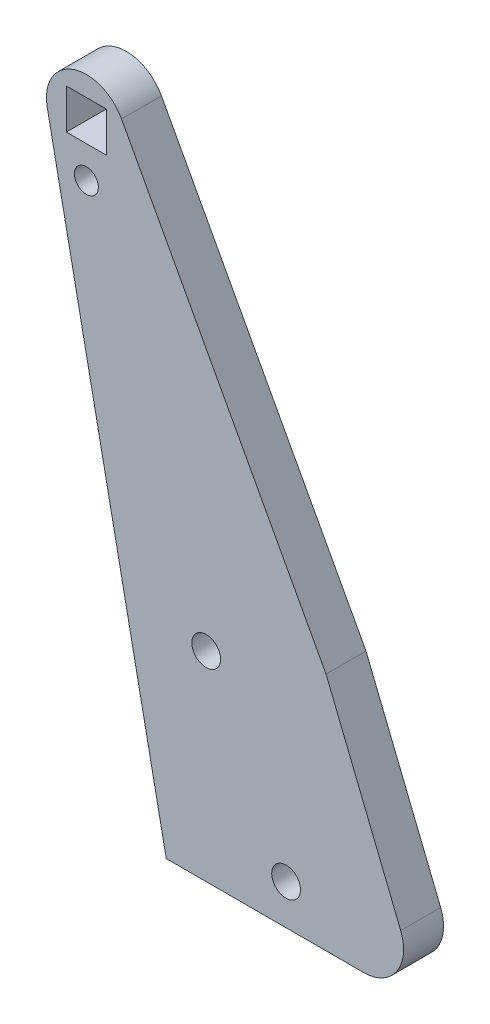
ISO-10303-21;
HEADER;
FILE_DESCRIPTION(('STEP AP214'),'2;1');
FILE_NAME('part.step','',(''),(''),'','','');
FILE_SCHEMA(('AUTOMOTIVE_DESIGN { 1 0 10303 214 1 1 1 1 }'));
ENDSEC;
DATA;
#1=APPLICATION_CONTEXT('core data for automotive mechanical design processes');
#2=APPLICATION_PROTOCOL_DEFINITION('international standard','automotive_design',2000,#1);
#3=PRODUCT_CONTEXT('',#1,'mechanical');
#4=PRODUCT('Part','Part','',(#3));
#5=PRODUCT_RELATED_PRODUCT_CATEGORY('part','',(#4));
#6=PRODUCT_DEFINITION_FORMATION('','',#4);
#7=PRODUCT_DEFINITION_CONTEXT('part definition',#1,'design');
#8=PRODUCT_DEFINITION('design','',#6,#7);
#9=PRODUCT_DEFINITION_SHAPE('','',#8);
#10=(LENGTH_UNIT() NAMED_UNIT(*) SI_UNIT(.MILLI.,.METRE.));
#11=(NAMED_UNIT(*) PLANE_ANGLE_UNIT() SI_UNIT($,.RADIAN.));
#12=(NAMED_UNIT(*) SI_UNIT($,.STERADIAN.) SOLID_ANGLE_UNIT());
#13=UNCERTAINTY_MEASURE_WITH_UNIT(LENGTH_MEASURE(1.E-05),#10,'distance_accuracy_value','');
#14=(GEOMETRIC_REPRESENTATION_CONTEXT(3) GLOBAL_UNCERTAINTY_ASSIGNED_CONTEXT((#13)) GLOBAL_UNIT_ASSIGNED_CONTEXT((#10,
#11,#12)) REPRESENTATION_CONTEXT('',''));
#15=CARTESIAN_POINT('',(0.,0.,0.));
#16=DIRECTION('',(0.,0.,1.));
#17=DIRECTION('',(1.,0.,0.));
#18=AXIS2_PLACEMENT_3D('',#15,#16,#17);
#19=CARTESIAN_POINT('',(0.,0.,-6.35));
#20=DIRECTION('',(0.,-1.,0.));
#21=DIRECTION('',(0.,0.,-1.));
#22=AXIS2_PLACEMENT_3D('',#19,#20,#21);
#23=PLANE('',#22);
#24=DIRECTION('',(1.,0.,0.));
#25=VECTOR('',#24,1.);
#26=CARTESIAN_POINT('',(15.3933992043195,0.,-6.35));
#27=LINE('',#26,#25);
#28=CARTESIAN_POINT('',(-25.4,0.,-6.35));
#29=VERTEX_POINT('',#28);
#30=CARTESIAN_POINT('',(5.97913705426362,0.,-6.35));
#31=VERTEX_POINT('',#30);
#32=EDGE_CURVE('E194',#29,#31,#27,.T.);
#33=ORIENTED_EDGE('',*,*,#32,.T.);
#34=DIRECTION('',(0.,0.,1.));
#35=VECTOR('',#34,1.);
#36=CARTESIAN_POINT('',(5.97913705426361,0.,-6.35));
#37=LINE('',#36,#35);
#38=CARTESIAN_POINT('',(5.97913705426361,0.,0.));
#39=VERTEX_POINT('',#38);
#40=EDGE_CURVE('E227',#31,#39,#37,.T.);
#41=ORIENTED_EDGE('',*,*,#40,.T.);
#42=DIRECTION('',(1.,0.,0.));
#43=VECTOR('',#42,1.);
#44=CARTESIAN_POINT('',(0.,0.,0.));
#45=LINE('',#44,#43);
#46=CARTESIAN_POINT('',(-25.4,0.,0.));
#47=VERTEX_POINT('',#46);
#48=EDGE_CURVE('E198',#47,#39,#45,.T.);
#49=ORIENTED_EDGE('',*,*,#48,.F.);
#50=DIRECTION('',(0.,0.,1.));
#51=VECTOR('',#50,1.);
#52=CARTESIAN_POINT('',(-25.4,0.,-6.35));
#53=LINE('',#52,#51);
#54=EDGE_CURVE('E225',#29,#47,#53,.T.);
#55=ORIENTED_EDGE('',*,*,#54,.F.);
#56=EDGE_LOOP('',(#33,#41,#49,#55));
#57=FACE_BOUND('',#56,.T.);
#58=ADVANCED_FACE('F45',(#57),#23,.T.);
#59=CARTESIAN_POINT('',(-44.3250806110003,93.9966559185333,-6.35));
#60=DIRECTION('',(-0.980327655275644,-0.197377020703419,0.));
#61=DIRECTION('',(0.197377020703419,-0.980327655275644,0.));
#62=AXIS2_PLACEMENT_3D('',#59,#60,#61);
#63=PLANE('',#62);
#64=DIRECTION('',(0.197377020703419,-0.980327655275644,0.));
#65=VECTOR('',#64,1.);
#66=CARTESIAN_POINT('',(-44.3250806110003,93.9966559185333,0.));
#67=LINE('',#66,#65);
#68=CARTESIAN_POINT('',(-44.3250806110003,93.9966559185333,0.));
#69=VERTEX_POINT('',#68);
#70=EDGE_CURVE('E221',#69,#47,#67,.T.);
#71=ORIENTED_EDGE('',*,*,#70,.F.);
#72=DIRECTION('',(0.,0.,1.));
#73=VECTOR('',#72,1.);
#74=CARTESIAN_POINT('',(-44.3250806110003,93.9966559185333,-6.35));
#75=LINE('',#74,#73);
#76=CARTESIAN_POINT('',(-44.3250806110003,93.9966559185333,-6.35));
#77=VERTEX_POINT('',#76);
#78=EDGE_CURVE('E228',#77,#69,#75,.T.);
#79=ORIENTED_EDGE('',*,*,#78,.F.);
#80=DIRECTION('',(0.197377020703419,-0.980327655275644,0.));
#81=VECTOR('',#80,1.);
#82=CARTESIAN_POINT('',(-44.3250806110003,93.9966559185333,-6.35));
#83=LINE('',#82,#81);
#84=EDGE_CURVE('E207',#77,#29,#83,.T.);
#85=ORIENTED_EDGE('',*,*,#84,.T.);
#86=ORIENTED_EDGE('',*,*,#54,.T.);
#87=EDGE_LOOP('',(#71,#79,#85,#86));
#88=FACE_BOUND('',#87,.T.);
#89=ADVANCED_FACE('F248',(#88),#63,.T.);
#90=CARTESIAN_POINT('',(-38.1,95.25,-6.35));
#91=DIRECTION('',(0.,0.,1.));
#92=DIRECTION('',(1.,0.,0.));
#93=AXIS2_PLACEMENT_3D('',#90,#91,#92);
#94=CYLINDRICAL_SURFACE('',#93,6.34999999999999);
#95=CARTESIAN_POINT('',(-38.1,95.25,0.));
#96=DIRECTION('',(0.,0.,1.));
#97=DIRECTION('',(1.,0.,0.));
#98=AXIS2_PLACEMENT_3D('',#95,#96,#97);
#99=CIRCLE('',#98,6.34999999999999);
#100=CARTESIAN_POINT('',(-32.5134672012353,98.2687996436209,0.));
#101=VERTEX_POINT('',#100);
#102=EDGE_CURVE('E217',#101,#69,#99,.T.);
#103=ORIENTED_EDGE('',*,*,#102,.F.);
#104=DIRECTION('',(0.,0.,1.));
#105=VECTOR('',#104,1.);
#106=CARTESIAN_POINT('',(-32.5134672012353,98.2687996436209,-6.35));
#107=LINE('',#106,#105);
#108=CARTESIAN_POINT('',(-32.5134672012353,98.2687996436209,-6.35));
#109=VERTEX_POINT('',#108);
#110=EDGE_CURVE('E231',#109,#101,#107,.T.);
#111=ORIENTED_EDGE('',*,*,#110,.F.);
#112=CARTESIAN_POINT('',(-38.1,95.25,-6.35));
#113=DIRECTION('',(0.,0.,1.));
#114=DIRECTION('',(1.,0.,0.));
#115=AXIS2_PLACEMENT_3D('',#112,#113,#114);
#116=CIRCLE('',#115,6.34999999999999);
#117=EDGE_CURVE('E204',#109,#77,#116,.T.);
#118=ORIENTED_EDGE('',*,*,#117,.T.);
#119=ORIENTED_EDGE('',*,*,#78,.T.);
#120=EDGE_LOOP('',(#103,#111,#118,#119));
#121=FACE_BOUND('',#120,.T.);
#122=ADVANCED_FACE('F253',(#121),#94,.T.);
#123=CARTESIAN_POINT('',(-32.5134672012353,98.2687996436209,-6.35));
#124=DIRECTION('',(0.879768944687359,0.475401518680462,0.));
#125=DIRECTION('',(-0.475401518680462,0.87976894468736,0.));
#126=AXIS2_PLACEMENT_3D('',#123,#124,#125);
#127=PLANE('',#126);
#128=DIRECTION('',(-0.475401518680462,0.87976894468736,0.));
#129=VECTOR('',#128,1.);
#130=CARTESIAN_POINT('',(-32.5134672012353,98.2687996436209,0.));
#131=LINE('',#130,#129);
#132=CARTESIAN_POINT('',(0.,38.1,0.));
#133=VERTEX_POINT('',#132);
#134=EDGE_CURVE('E213',#133,#101,#131,.T.);
#135=ORIENTED_EDGE('',*,*,#134,.F.);
#136=DIRECTION('',(0.,0.,1.));
#137=VECTOR('',#136,1.);
#138=CARTESIAN_POINT('',(0.,38.1,-6.35));
#139=LINE('',#138,#137);
#140=CARTESIAN_POINT('',(0.,38.1,-6.35));
#141=VERTEX_POINT('',#140);
#142=EDGE_CURVE('E211',#141,#133,#139,.T.);
#143=ORIENTED_EDGE('',*,*,#142,.F.);
#144=DIRECTION('',(-0.475401518680462,0.87976894468736,0.));
#145=VECTOR('',#144,1.);
#146=CARTESIAN_POINT('',(-32.5134672012353,98.2687996436209,-6.35));
#147=LINE('',#146,#145);
#148=EDGE_CURVE('E200',#141,#109,#147,.T.);
#149=ORIENTED_EDGE('',*,*,#148,.T.);
#150=ORIENTED_EDGE('',*,*,#110,.T.);
#151=EDGE_LOOP('',(#135,#143,#149,#150));
#152=FACE_BOUND('',#151,.T.);
#153=ADVANCED_FACE('F256',(#152),#127,.T.);
#154=CARTESIAN_POINT('',(0.,38.1,-6.35));
#155=DIRECTION('',(0.927183854566787,0.374606593415913,0.));
#156=DIRECTION('',(-0.374606593415913,0.927183854566787,0.));
#157=AXIS2_PLACEMENT_3D('',#154,#155,#156);
#158=PLANE('',#157);
#159=DIRECTION('',(-0.374606593415913,0.927183854566787,0.));
#160=VECTOR('',#159,1.);
#161=CARTESIAN_POINT('',(0.,38.1,0.));
#162=LINE('',#161,#160);
#163=CARTESIAN_POINT('',(11.8667545307627,8.72875186819105,0.));
#164=VERTEX_POINT('',#163);
#165=EDGE_CURVE('E188',#164,#133,#162,.T.);
#166=ORIENTED_EDGE('',*,*,#165,.F.);
#167=DIRECTION('',(0.,0.,1.));
#168=VECTOR('',#167,1.);
#169=CARTESIAN_POINT('',(11.8667545307627,8.72875186819105,-6.35));
#170=LINE('',#169,#168);
#171=CARTESIAN_POINT('',(11.8667545307627,8.72875186819105,-6.35));
#172=VERTEX_POINT('',#171);
#173=EDGE_CURVE('E53',#164,#172,#170,.F.);
#174=ORIENTED_EDGE('',*,*,#173,.T.);
#175=DIRECTION('',(-0.374606593415913,0.927183854566787,0.));
#176=VECTOR('',#175,1.);
#177=CARTESIAN_POINT('',(0.,38.1,-6.35));
#178=LINE('',#177,#176);
#179=EDGE_CURVE('E197',#172,#141,#178,.T.);
#180=ORIENTED_EDGE('',*,*,#179,.T.);
#181=ORIENTED_EDGE('',*,*,#142,.T.);
#182=EDGE_LOOP('',(#166,#174,#180,#181));
#183=FACE_BOUND('',#182,.T.);
#184=ADVANCED_FACE('F280',(#183),#158,.T.);
#185=CARTESIAN_POINT('',(-38.1,95.25,-6.35));
#186=DIRECTION('',(0.,0.,1.));
#187=DIRECTION('',(1.,0.,0.));
#188=AXIS2_PLACEMENT_3D('',#185,#186,#187);
#189=PLANE('',#188);
#190=CARTESIAN_POINT('',(-38.0999999999995,86.9949999999997,-6.35));
#191=DIRECTION('',(0.,0.,1.));
#192=DIRECTION('',(1.,0.,0.));
#193=AXIS2_PLACEMENT_3D('',#190,#191,#192);
#194=CIRCLE('',#193,1.90499999999955);
#195=CARTESIAN_POINT('',(-36.1949999999999,86.9949999999997,-6.35));
#196=VERTEX_POINT('',#195);
#197=EDGE_CURVE('E319',#196,#196,#194,.T.);
#198=ORIENTED_EDGE('',*,*,#197,.T.);
#199=EDGE_LOOP('',(#198));
#200=FACE_BOUND('',#199,.T.);
#201=CARTESIAN_POINT('',(-6.35,6.35,-6.35));
#202=DIRECTION('',(0.,0.,1.));
#203=DIRECTION('',(1.,0.,0.));
#204=AXIS2_PLACEMENT_3D('',#201,#202,#203);
#205=CIRCLE('',#204,2.286);
#206=CARTESIAN_POINT('',(-4.064,6.35,-6.35));
#207=VERTEX_POINT('',#206);
#208=EDGE_CURVE('E314',#207,#207,#205,.T.);
#209=ORIENTED_EDGE('',*,*,#208,.T.);
#210=EDGE_LOOP('',(#209));
#211=FACE_BOUND('',#210,.T.);
#212=CARTESIAN_POINT('',(-19.05,31.75,-6.35));
#213=DIRECTION('',(0.,0.,1.));
#214=DIRECTION('',(1.,0.,0.));
#215=AXIS2_PLACEMENT_3D('',#212,#213,#214);
#216=CIRCLE('',#215,2.286);
#217=CARTESIAN_POINT('',(-16.764,31.75,-6.35));
#218=VERTEX_POINT('',#217);
#219=EDGE_CURVE('E179',#218,#218,#216,.T.);
#220=ORIENTED_EDGE('',*,*,#219,.T.);
#221=EDGE_LOOP('',(#220));
#222=FACE_BOUND('',#221,.T.);
#223=DIRECTION('',(1.,0.,0.));
#224=VECTOR('',#223,1.);
#225=CARTESIAN_POINT('',(-41.275,92.075,-6.35));
#226=LINE('',#225,#224);
#227=CARTESIAN_POINT('',(-41.275,92.075,-6.35));
#228=VERTEX_POINT('',#227);
#229=CARTESIAN_POINT('',(-34.925,92.075,-6.35));
#230=VERTEX_POINT('',#229);
#231=EDGE_CURVE('E145',#228,#230,#226,.T.);
#232=ORIENTED_EDGE('',*,*,#231,.T.);
#233=DIRECTION('',(0.,1.,0.));
#234=VECTOR('',#233,1.);
#235=CARTESIAN_POINT('',(-34.925,98.425,-6.35));
#236=LINE('',#235,#234);
#237=CARTESIAN_POINT('',(-34.925,98.425,-6.35));
#238=VERTEX_POINT('',#237);
#239=EDGE_CURVE('E136',#230,#238,#236,.T.);
#240=ORIENTED_EDGE('',*,*,#239,.T.);
#241=DIRECTION('',(-1.,0.,0.));
#242=VECTOR('',#241,1.);
#243=CARTESIAN_POINT('',(-41.275,98.425,-6.35));
#244=LINE('',#243,#242);
#245=CARTESIAN_POINT('',(-41.275,98.425,-6.35));
#246=VERTEX_POINT('',#245);
#247=EDGE_CURVE('E149',#238,#246,#244,.T.);
#248=ORIENTED_EDGE('',*,*,#247,.T.);
#249=DIRECTION('',(0.,-1.,0.));
#250=VECTOR('',#249,1.);
#251=CARTESIAN_POINT('',(-41.275,98.425,-6.35));
#252=LINE('',#251,#250);
#253=EDGE_CURVE('E154',#246,#228,#252,.T.);
#254=ORIENTED_EDGE('',*,*,#253,.T.);
#255=EDGE_LOOP('',(#232,#240,#248,#254));
#256=FACE_BOUND('',#255,.T.);
#257=ORIENTED_EDGE('',*,*,#179,.F.);
#258=CARTESIAN_POINT('',(5.97913705426361,6.35,-6.35));
#259=DIRECTION('',(0.,0.,1.));
#260=DIRECTION('',(1.,0.,0.));
#261=AXIS2_PLACEMENT_3D('',#258,#259,#260);
#262=CIRCLE('',#261,6.35);
#263=EDGE_CURVE('E11',#172,#31,#262,.F.);
#264=ORIENTED_EDGE('',*,*,#263,.T.);
#265=ORIENTED_EDGE('',*,*,#32,.F.);
#266=ORIENTED_EDGE('',*,*,#84,.F.);
#267=ORIENTED_EDGE('',*,*,#117,.F.);
#268=ORIENTED_EDGE('',*,*,#148,.F.);
#269=EDGE_LOOP('',(#257,#264,#265,#266,#267,#268));
#270=FACE_BOUND('',#269,.T.);
#271=ADVANCED_FACE('F156',(#200,#211,#222,#256,#270),#189,.F.);
#272=CARTESIAN_POINT('',(-38.1,95.25,0.));
#273=DIRECTION('',(0.,0.,1.));
#274=DIRECTION('',(1.,0.,0.));
#275=AXIS2_PLACEMENT_3D('',#272,#273,#274);
#276=PLANE('',#275);
#277=CARTESIAN_POINT('',(-38.0999999999995,86.9949999999997,0.));
#278=DIRECTION('',(0.,0.,1.));
#279=DIRECTION('',(1.,0.,0.));
#280=AXIS2_PLACEMENT_3D('',#277,#278,#279);
#281=CIRCLE('',#280,1.90499999999955);
#282=CARTESIAN_POINT('',(-36.1949999999999,86.9949999999997,0.));
#283=VERTEX_POINT('',#282);
#284=EDGE_CURVE('E323',#283,#283,#281,.T.);
#285=ORIENTED_EDGE('',*,*,#284,.F.);
#286=EDGE_LOOP('',(#285));
#287=FACE_BOUND('',#286,.T.);
#288=CARTESIAN_POINT('',(-6.35,6.35,0.));
#289=DIRECTION('',(0.,0.,1.));
#290=DIRECTION('',(1.,0.,0.));
#291=AXIS2_PLACEMENT_3D('',#288,#289,#290);
#292=CIRCLE('',#291,2.286);
#293=CARTESIAN_POINT('',(-4.064,6.35,0.));
#294=VERTEX_POINT('',#293);
#295=EDGE_CURVE('E317',#294,#294,#292,.T.);
#296=ORIENTED_EDGE('',*,*,#295,.F.);
#297=EDGE_LOOP('',(#296));
#298=FACE_BOUND('',#297,.T.);
#299=CARTESIAN_POINT('',(-19.05,31.75,0.));
#300=DIRECTION('',(0.,0.,1.));
#301=DIRECTION('',(1.,0.,0.));
#302=AXIS2_PLACEMENT_3D('',#299,#300,#301);
#303=CIRCLE('',#302,2.286);
#304=CARTESIAN_POINT('',(-16.764,31.75,0.));
#305=VERTEX_POINT('',#304);
#306=EDGE_CURVE('E169',#305,#305,#303,.T.);
#307=ORIENTED_EDGE('',*,*,#306,.F.);
#308=EDGE_LOOP('',(#307));
#309=FACE_BOUND('',#308,.T.);
#310=DIRECTION('',(0.,1.,0.));
#311=VECTOR('',#310,1.);
#312=CARTESIAN_POINT('',(-34.925,98.425,0.));
#313=LINE('',#312,#311);
#314=CARTESIAN_POINT('',(-34.925,92.075,0.));
#315=VERTEX_POINT('',#314);
#316=CARTESIAN_POINT('',(-34.925,98.425,0.));
#317=VERTEX_POINT('',#316);
#318=EDGE_CURVE('E139',#315,#317,#313,.T.);
#319=ORIENTED_EDGE('',*,*,#318,.F.);
#320=DIRECTION('',(1.,0.,0.));
#321=VECTOR('',#320,1.);
#322=CARTESIAN_POINT('',(-41.275,92.075,0.));
#323=LINE('',#322,#321);
#324=CARTESIAN_POINT('',(-41.275,92.075,0.));
#325=VERTEX_POINT('',#324);
#326=EDGE_CURVE('E160',#325,#315,#323,.T.);
#327=ORIENTED_EDGE('',*,*,#326,.F.);
#328=DIRECTION('',(0.,-1.,0.));
#329=VECTOR('',#328,1.);
#330=CARTESIAN_POINT('',(-41.275,98.425,0.));
#331=LINE('',#330,#329);
#332=CARTESIAN_POINT('',(-41.275,98.425,0.));
#333=VERTEX_POINT('',#332);
#334=EDGE_CURVE('E166',#333,#325,#331,.T.);
#335=ORIENTED_EDGE('',*,*,#334,.F.);
#336=DIRECTION('',(-1.,0.,0.));
#337=VECTOR('',#336,1.);
#338=CARTESIAN_POINT('',(-41.275,98.425,0.));
#339=LINE('',#338,#337);
#340=EDGE_CURVE('E178',#317,#333,#339,.T.);
#341=ORIENTED_EDGE('',*,*,#340,.F.);
#342=EDGE_LOOP('',(#319,#327,#335,#341));
#343=FACE_BOUND('',#342,.T.);
#344=ORIENTED_EDGE('',*,*,#48,.T.);
#345=CARTESIAN_POINT('',(5.97913705426361,6.35,0.));
#346=DIRECTION('',(0.,0.,1.));
#347=DIRECTION('',(1.,0.,0.));
#348=AXIS2_PLACEMENT_3D('',#345,#346,#347);
#349=CIRCLE('',#348,6.35);
#350=EDGE_CURVE('E67',#39,#164,#349,.T.);
#351=ORIENTED_EDGE('',*,*,#350,.T.);
#352=ORIENTED_EDGE('',*,*,#165,.T.);
#353=ORIENTED_EDGE('',*,*,#134,.T.);
#354=ORIENTED_EDGE('',*,*,#102,.T.);
#355=ORIENTED_EDGE('',*,*,#70,.T.);
#356=EDGE_LOOP('',(#344,#351,#352,#353,#354,#355));
#357=FACE_BOUND('',#356,.T.);
#358=ADVANCED_FACE('F244',(#287,#298,#309,#343,#357),#276,.T.);
#359=CARTESIAN_POINT('',(-34.925,98.425,-6.35));
#360=DIRECTION('',(1.,0.,0.));
#361=DIRECTION('',(0.,0.,-1.));
#362=AXIS2_PLACEMENT_3D('',#359,#360,#361);
#363=PLANE('',#362);
#364=ORIENTED_EDGE('',*,*,#318,.T.);
#365=DIRECTION('',(0.,0.,1.));
#366=VECTOR('',#365,1.);
#367=CARTESIAN_POINT('',(-34.925,98.425,-6.35));
#368=LINE('',#367,#366);
#369=EDGE_CURVE('E132',#238,#317,#368,.T.);
#370=ORIENTED_EDGE('',*,*,#369,.F.);
#371=ORIENTED_EDGE('',*,*,#239,.F.);
#372=DIRECTION('',(0.,0.,1.));
#373=VECTOR('',#372,1.);
#374=CARTESIAN_POINT('',(-34.925,92.075,-6.35));
#375=LINE('',#374,#373);
#376=EDGE_CURVE('E185',#230,#315,#375,.T.);
#377=ORIENTED_EDGE('',*,*,#376,.T.);
#378=EDGE_LOOP('',(#364,#370,#371,#377));
#379=FACE_BOUND('',#378,.T.);
#380=ADVANCED_FACE('F134',(#379),#363,.F.);
#381=CARTESIAN_POINT('',(-41.275,92.075,-6.35));
#382=DIRECTION('',(0.,-1.,0.));
#383=DIRECTION('',(0.,0.,-1.));
#384=AXIS2_PLACEMENT_3D('',#381,#382,#383);
#385=PLANE('',#384);
#386=ORIENTED_EDGE('',*,*,#326,.T.);
#387=ORIENTED_EDGE('',*,*,#376,.F.);
#388=ORIENTED_EDGE('',*,*,#231,.F.);
#389=DIRECTION('',(0.,0.,1.));
#390=VECTOR('',#389,1.);
#391=CARTESIAN_POINT('',(-41.275,92.075,-6.35));
#392=LINE('',#391,#390);
#393=EDGE_CURVE('E189',#228,#325,#392,.T.);
#394=ORIENTED_EDGE('',*,*,#393,.T.);
#395=EDGE_LOOP('',(#386,#387,#388,#394));
#396=FACE_BOUND('',#395,.T.);
#397=ADVANCED_FACE('F293',(#396),#385,.F.);
#398=CARTESIAN_POINT('',(-41.275,98.425,-6.35));
#399=DIRECTION('',(-1.,0.,0.));
#400=DIRECTION('',(0.,0.,1.));
#401=AXIS2_PLACEMENT_3D('',#398,#399,#400);
#402=PLANE('',#401);
#403=ORIENTED_EDGE('',*,*,#334,.T.);
#404=ORIENTED_EDGE('',*,*,#393,.F.);
#405=ORIENTED_EDGE('',*,*,#253,.F.);
#406=DIRECTION('',(0.,0.,1.));
#407=VECTOR('',#406,1.);
#408=CARTESIAN_POINT('',(-41.275,98.425,-6.35));
#409=LINE('',#408,#407);
#410=EDGE_CURVE('E144',#246,#333,#409,.T.);
#411=ORIENTED_EDGE('',*,*,#410,.T.);
#412=EDGE_LOOP('',(#403,#404,#405,#411));
#413=FACE_BOUND('',#412,.T.);
#414=ADVANCED_FACE('F297',(#413),#402,.F.);
#415=CARTESIAN_POINT('',(-41.275,98.425,-6.35));
#416=DIRECTION('',(0.,1.,0.));
#417=DIRECTION('',(0.,0.,1.));
#418=AXIS2_PLACEMENT_3D('',#415,#416,#417);
#419=PLANE('',#418);
#420=ORIENTED_EDGE('',*,*,#340,.T.);
#421=ORIENTED_EDGE('',*,*,#410,.F.);
#422=ORIENTED_EDGE('',*,*,#247,.F.);
#423=ORIENTED_EDGE('',*,*,#369,.T.);
#424=EDGE_LOOP('',(#420,#421,#422,#423));
#425=FACE_BOUND('',#424,.T.);
#426=ADVANCED_FACE('F150',(#425),#419,.F.);
#427=CARTESIAN_POINT('',(-19.05,31.75,-6.35));
#428=DIRECTION('',(0.,0.,1.));
#429=DIRECTION('',(1.,0.,0.));
#430=AXIS2_PLACEMENT_3D('',#427,#428,#429);
#431=CYLINDRICAL_SURFACE('',#430,2.286);
#432=ORIENTED_EDGE('',*,*,#219,.F.);
#433=EDGE_LOOP('',(#432));
#434=FACE_BOUND('',#433,.T.);
#435=ORIENTED_EDGE('',*,*,#306,.T.);
#436=EDGE_LOOP('',(#435));
#437=FACE_BOUND('',#436,.T.);
#438=ADVANCED_FACE('F296',(#434,#437),#431,.F.);
#439=CARTESIAN_POINT('',(-6.35,6.35,-6.35));
#440=DIRECTION('',(0.,0.,1.));
#441=DIRECTION('',(1.,0.,0.));
#442=AXIS2_PLACEMENT_3D('',#439,#440,#441);
#443=CYLINDRICAL_SURFACE('',#442,2.286);
#444=ORIENTED_EDGE('',*,*,#208,.F.);
#445=EDGE_LOOP('',(#444));
#446=FACE_BOUND('',#445,.T.);
#447=ORIENTED_EDGE('',*,*,#295,.T.);
#448=EDGE_LOOP('',(#447));
#449=FACE_BOUND('',#448,.T.);
#450=ADVANCED_FACE('F264',(#446,#449),#443,.F.);
#451=CARTESIAN_POINT('',(-38.0999999999995,86.9949999999997,-6.35));
#452=DIRECTION('',(0.,0.,1.));
#453=DIRECTION('',(1.,0.,0.));
#454=AXIS2_PLACEMENT_3D('',#451,#452,#453);
#455=CYLINDRICAL_SURFACE('',#454,1.90499999999955);
#456=ORIENTED_EDGE('',*,*,#197,.F.);
#457=EDGE_LOOP('',(#456));
#458=FACE_BOUND('',#457,.T.);
#459=ORIENTED_EDGE('',*,*,#284,.T.);
#460=EDGE_LOOP('',(#459));
#461=FACE_BOUND('',#460,.T.);
#462=ADVANCED_FACE('F259',(#458,#461),#455,.F.);
#463=CARTESIAN_POINT('',(5.97913705426361,6.35,-6.35));
#464=DIRECTION('',(0.,0.,1.));
#465=DIRECTION('',(1.,0.,0.));
#466=AXIS2_PLACEMENT_3D('',#463,#464,#465);
#467=CYLINDRICAL_SURFACE('',#466,6.35);
#468=ORIENTED_EDGE('',*,*,#263,.F.);
#469=ORIENTED_EDGE('',*,*,#173,.F.);
#470=ORIENTED_EDGE('',*,*,#350,.F.);
#471=ORIENTED_EDGE('',*,*,#40,.F.);
#472=EDGE_LOOP('',(#468,#469,#470,#471));
#473=FACE_BOUND('',#472,.T.);
#474=ADVANCED_FACE('F47',(#473),#467,.T.);
#475=CLOSED_SHELL('',(#58,#89,#122,#153,#184,#271,#358,#380,#397,#414,#426,#438,#450,#462,#474));
#476=MANIFOLD_SOLID_BREP('B2',#475);
#477=ADVANCED_BREP_SHAPE_REPRESENTATION('',(#18,#476),#14);
#478=SHAPE_DEFINITION_REPRESENTATION(#9,#477);
ENDSEC;
END-ISO-10303-21;
